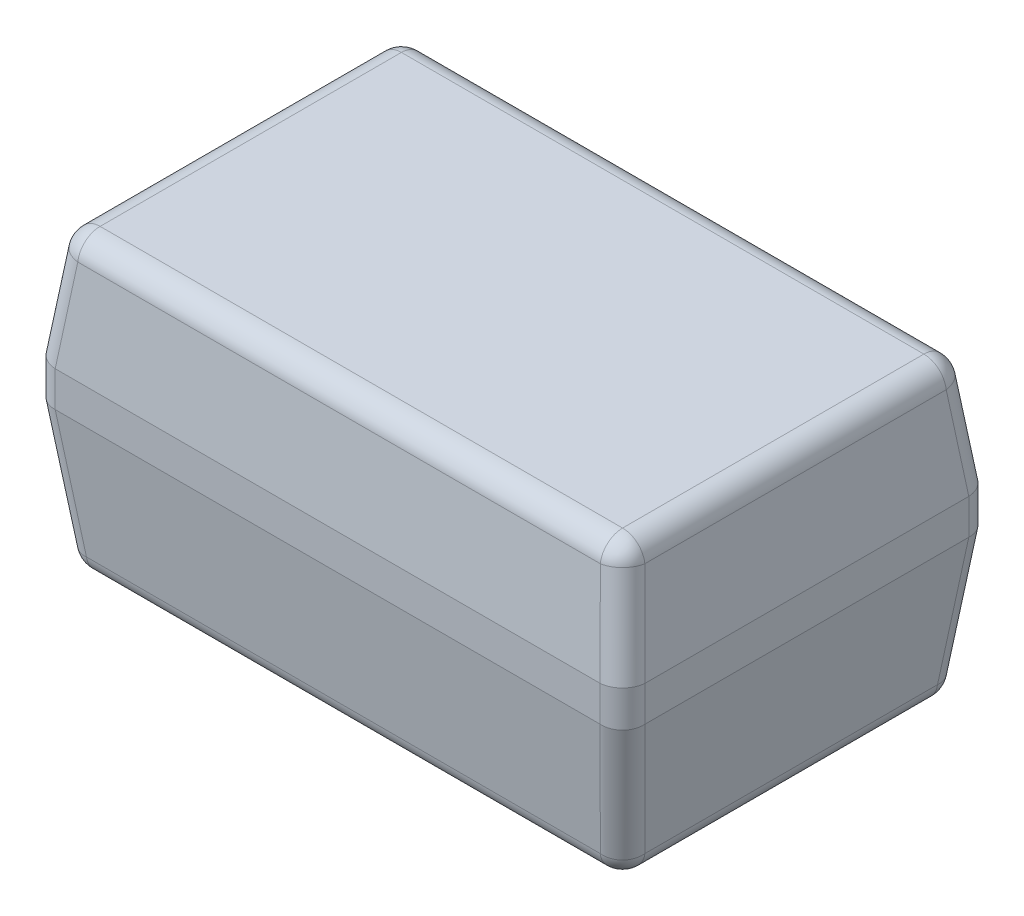
ISO-10303-21;
HEADER;
FILE_DESCRIPTION(('STEP AP214'),'2;1');
FILE_NAME('part.step','',(''),(''),'','','');
FILE_SCHEMA(('AUTOMOTIVE_DESIGN { 1 0 10303 214 1 1 1 1 }'));
ENDSEC;
DATA;
#1=APPLICATION_CONTEXT('core data for automotive mechanical design processes');
#2=APPLICATION_PROTOCOL_DEFINITION('international standard','automotive_design',2000,#1);
#3=PRODUCT_CONTEXT('',#1,'mechanical');
#4=PRODUCT('Part','Part','',(#3));
#5=PRODUCT_RELATED_PRODUCT_CATEGORY('part','',(#4));
#6=PRODUCT_DEFINITION_FORMATION('','',#4);
#7=PRODUCT_DEFINITION_CONTEXT('part definition',#1,'design');
#8=PRODUCT_DEFINITION('design','',#6,#7);
#9=PRODUCT_DEFINITION_SHAPE('','',#8);
#10=(LENGTH_UNIT() NAMED_UNIT(*) SI_UNIT(.MILLI.,.METRE.));
#11=(NAMED_UNIT(*) PLANE_ANGLE_UNIT() SI_UNIT($,.RADIAN.));
#12=(NAMED_UNIT(*) SI_UNIT($,.STERADIAN.) SOLID_ANGLE_UNIT());
#13=UNCERTAINTY_MEASURE_WITH_UNIT(LENGTH_MEASURE(1.E-05),#10,'distance_accuracy_value','');
#14=(GEOMETRIC_REPRESENTATION_CONTEXT(3) GLOBAL_UNCERTAINTY_ASSIGNED_CONTEXT((#13)) GLOBAL_UNIT_ASSIGNED_CONTEXT((#10,
#11,#12)) REPRESENTATION_CONTEXT('',''));
#15=CARTESIAN_POINT('',(0.,0.,0.));
#16=DIRECTION('',(0.,0.,1.));
#17=DIRECTION('',(1.,0.,0.));
#18=AXIS2_PLACEMENT_3D('',#15,#16,#17);
#19=CARTESIAN_POINT('',(-0.871191654389,-0.5438,-0.496191654389));
#20=DIRECTION('',(-0.662620048215886,-0.748955720788871,0.));
#21=DIRECTION('',(0.,0.,-1.));
#22=AXIS2_PLACEMENT_3D('',#19,#20,#21);
#23=SPHERICAL_SURFACE('',#22,0.0762);
#24=CARTESIAN_POINT('',(-0.871191654389,-0.5438,-0.496191654389));
#25=DIRECTION('',(0.,0.,-1.));
#26=DIRECTION('',(-1.,0.,0.));
#27=AXIS2_PLACEMENT_3D('',#24,#25,#26);
#28=CIRCLE('',#27,0.0762);
#29=CARTESIAN_POINT('',(-0.946823671144385,-0.553086443967047,-0.496191654389));
#30=VERTEX_POINT('',#29);
#31=CARTESIAN_POINT('',(-0.92168330206305,-0.600870425924112,-0.496191654389));
#32=VERTEX_POINT('',#31);
#33=EDGE_CURVE('E75',#30,#32,#28,.F.);
#34=ORIENTED_EDGE('',*,*,#33,.F.);
#35=CARTESIAN_POINT('',(-0.871191654389566,-0.5437999999997,-0.496191654389566));
#36=DIRECTION('',(-0.120974291151045,0.985256536015369,-0.120974291151045));
#37=DIRECTION('',(0.,0.121869343404831,0.992546151641361));
#38=AXIS2_PLACEMENT_3D('',#35,#36,#37);
#39=CIRCLE('',#38,0.0762);
#40=CARTESIAN_POINT('',(-0.871191654389408,-0.553086443967097,-0.571823671144379));
#41=VERTEX_POINT('',#40);
#42=EDGE_CURVE('E77',#41,#30,#39,.T.);
#43=ORIENTED_EDGE('',*,*,#42,.F.);
#44=CARTESIAN_POINT('',(-0.871191654389,-0.5438,-0.496191654389));
#45=DIRECTION('',(1.,0.,0.));
#46=DIRECTION('',(0.,0.,-1.));
#47=AXIS2_PLACEMENT_3D('',#44,#45,#46);
#48=CIRCLE('',#47,0.0762);
#49=CARTESIAN_POINT('',(-0.871191654389,-0.62,-0.496191654389));
#50=VERTEX_POINT('',#49);
#51=EDGE_CURVE('E21',#50,#41,#48,.T.);
#52=ORIENTED_EDGE('',*,*,#51,.F.);
#53=CARTESIAN_POINT('',(-0.871191654389,-0.5438,-0.496191654389));
#54=DIRECTION('',(0.,0.,-1.));
#55=DIRECTION('',(-1.,0.,0.));
#56=AXIS2_PLACEMENT_3D('',#53,#54,#55);
#57=CIRCLE('',#56,0.0762);
#58=EDGE_CURVE('E156',#32,#50,#57,.F.);
#59=ORIENTED_EDGE('',*,*,#58,.F.);
#60=EDGE_LOOP('',(#34,#43,#52,#59));
#61=FACE_BOUND('',#60,.T.);
#62=ADVANCED_FACE('F17',(#61),#23,.T.);
#63=CARTESIAN_POINT('',(0.,-0.62,0.));
#64=DIRECTION('',(0.,-1.,0.));
#65=DIRECTION('',(0.,0.,-1.));
#66=AXIS2_PLACEMENT_3D('',#63,#64,#65);
#67=PLANE('',#66);
#68=DIRECTION('',(0.,0.,-1.));
#69=VECTOR('',#68,1.);
#70=CARTESIAN_POINT('',(-0.871191654389,-0.62,0.563607719548));
#71=LINE('',#70,#69);
#72=CARTESIAN_POINT('',(-0.871191654389,-0.62,0.496191654389));
#73=VERTEX_POINT('',#72);
#74=EDGE_CURVE('E186',#50,#73,#71,.F.);
#75=ORIENTED_EDGE('',*,*,#74,.F.);
#76=DIRECTION('',(1.,0.,0.));
#77=VECTOR('',#76,1.);
#78=CARTESIAN_POINT('',(-0.938607719548,-0.62,-0.496191654389));
#79=LINE('',#78,#77);
#80=CARTESIAN_POINT('',(0.871191654389,-0.62,-0.496191654389));
#81=VERTEX_POINT('',#80);
#82=EDGE_CURVE('E183',#81,#50,#79,.F.);
#83=ORIENTED_EDGE('',*,*,#82,.F.);
#84=DIRECTION('',(0.,0.,-1.));
#85=VECTOR('',#84,1.);
#86=CARTESIAN_POINT('',(0.871191654389,-0.62,0.));
#87=LINE('',#86,#85);
#88=CARTESIAN_POINT('',(0.871191654389,-0.62,0.496191654389));
#89=VERTEX_POINT('',#88);
#90=EDGE_CURVE('E182',#81,#89,#87,.F.);
#91=ORIENTED_EDGE('',*,*,#90,.T.);
#92=DIRECTION('',(-1.,0.,0.));
#93=VECTOR('',#92,1.);
#94=CARTESIAN_POINT('',(0.871191654389,-0.62,0.496191654389));
#95=LINE('',#94,#93);
#96=EDGE_CURVE('E148',#73,#89,#95,.F.);
#97=ORIENTED_EDGE('',*,*,#96,.F.);
#98=EDGE_LOOP('',(#75,#83,#91,#97));
#99=FACE_BOUND('',#98,.T.);
#100=ADVANCED_FACE('F178',(#99),#67,.T.);
#101=CARTESIAN_POINT('',(-0.871191654389,-0.5438,0.496191654389));
#102=DIRECTION('',(0.,-0.748955720788871,0.662620048215886));
#103=DIRECTION('',(-1.,0.,0.));
#104=AXIS2_PLACEMENT_3D('',#101,#102,#103);
#105=SPHERICAL_SURFACE('',#104,0.0762);
#106=CARTESIAN_POINT('',(-0.871191654389,-0.5438,0.496191654389));
#107=DIRECTION('',(-1.,0.,0.));
#108=DIRECTION('',(0.,0.,1.));
#109=AXIS2_PLACEMENT_3D('',#106,#107,#108);
#110=CIRCLE('',#109,0.0762);
#111=CARTESIAN_POINT('',(-0.871191654389283,-0.553086443967082,0.571823671144381));
#112=VERTEX_POINT('',#111);
#113=CARTESIAN_POINT('',(-0.871191654389,-0.600870425924112,0.54668330206305));
#114=VERTEX_POINT('',#113);
#115=EDGE_CURVE('E124',#112,#114,#110,.F.);
#116=ORIENTED_EDGE('',*,*,#115,.F.);
#117=CARTESIAN_POINT('',(-0.871191654389566,-0.5437999999997,0.496191654389566));
#118=DIRECTION('',(-0.120974291151045,0.985256536015369,0.120974291151045));
#119=DIRECTION('',(0.,-0.121869343404831,0.992546151641361));
#120=AXIS2_PLACEMENT_3D('',#117,#118,#119);
#121=CIRCLE('',#120,0.0762);
#122=CARTESIAN_POINT('',(-0.946823671144379,-0.553086443967097,0.496191654389408));
#123=VERTEX_POINT('',#122);
#124=EDGE_CURVE('E71',#123,#112,#121,.T.);
#125=ORIENTED_EDGE('',*,*,#124,.F.);
#126=CARTESIAN_POINT('',(-0.871191654389,-0.5438,0.496191654389));
#127=DIRECTION('',(0.,0.,-1.));
#128=DIRECTION('',(-1.,0.,0.));
#129=AXIS2_PLACEMENT_3D('',#126,#127,#128);
#130=CIRCLE('',#129,0.0762);
#131=EDGE_CURVE('E61',#73,#123,#130,.T.);
#132=ORIENTED_EDGE('',*,*,#131,.F.);
#133=CARTESIAN_POINT('',(-0.871191654389,-0.5438,0.496191654389));
#134=DIRECTION('',(-1.,0.,0.));
#135=DIRECTION('',(0.,0.,1.));
#136=AXIS2_PLACEMENT_3D('',#133,#134,#135);
#137=CIRCLE('',#136,0.0762);
#138=EDGE_CURVE('E113',#114,#73,#137,.F.);
#139=ORIENTED_EDGE('',*,*,#138,.F.);
#140=EDGE_LOOP('',(#116,#125,#132,#139));
#141=FACE_BOUND('',#140,.T.);
#142=ADVANCED_FACE('F176',(#141),#105,.T.);
#143=CARTESIAN_POINT('',(0.871191654389,-0.5438,0.496191654389));
#144=DIRECTION('',(0.,-0.748955720788871,0.662620048215886));
#145=DIRECTION('',(1.,0.,0.));
#146=AXIS2_PLACEMENT_3D('',#143,#144,#145);
#147=SPHERICAL_SURFACE('',#146,0.0762);
#148=CARTESIAN_POINT('',(0.871191654389,-0.5438,0.496191654389));
#149=DIRECTION('',(-1.,0.,0.));
#150=DIRECTION('',(0.,0.,1.));
#151=AXIS2_PLACEMENT_3D('',#148,#149,#150);
#152=CIRCLE('',#151,0.0762);
#153=CARTESIAN_POINT('',(0.871191654389,-0.600870425924112,0.54668330206305));
#154=VERTEX_POINT('',#153);
#155=EDGE_CURVE('E123',#89,#154,#152,.T.);
#156=ORIENTED_EDGE('',*,*,#155,.F.);
#157=CARTESIAN_POINT('',(0.871191654389,-0.5438,0.496191654389));
#158=DIRECTION('',(0.,0.,1.));
#159=DIRECTION('',(1.,0.,0.));
#160=AXIS2_PLACEMENT_3D('',#157,#158,#159);
#161=CIRCLE('',#160,0.0762);
#162=CARTESIAN_POINT('',(0.946823671144385,-0.553086443967047,0.496191654389));
#163=VERTEX_POINT('',#162);
#164=EDGE_CURVE('E107',#163,#89,#161,.F.);
#165=ORIENTED_EDGE('',*,*,#164,.F.);
#166=CARTESIAN_POINT('',(0.871191654389566,-0.5437999999997,0.496191654389566));
#167=DIRECTION('',(0.120974291151045,0.985256536015369,0.120974291151045));
#168=DIRECTION('',(0.,-0.121869343404831,0.992546151641361));
#169=AXIS2_PLACEMENT_3D('',#166,#167,#168);
#170=CIRCLE('',#169,0.0762);
#171=CARTESIAN_POINT('',(0.871191654389283,-0.553086443967082,0.571823671144381));
#172=VERTEX_POINT('',#171);
#173=EDGE_CURVE('E100',#172,#163,#170,.T.);
#174=ORIENTED_EDGE('',*,*,#173,.F.);
#175=CARTESIAN_POINT('',(0.871191654389,-0.5438,0.496191654389));
#176=DIRECTION('',(-1.,0.,0.));
#177=DIRECTION('',(0.,0.,1.));
#178=AXIS2_PLACEMENT_3D('',#175,#176,#177);
#179=CIRCLE('',#178,0.0762);
#180=EDGE_CURVE('E104',#154,#172,#179,.T.);
#181=ORIENTED_EDGE('',*,*,#180,.F.);
#182=EDGE_LOOP('',(#156,#165,#174,#181));
#183=FACE_BOUND('',#182,.T.);
#184=ADVANCED_FACE('F103',(#183),#147,.T.);
#185=CARTESIAN_POINT('',(0.871191654389,-0.5438,-0.496191654389));
#186=DIRECTION('',(0.,-0.748955720788871,-0.662620048215886));
#187=DIRECTION('',(1.,0.,0.));
#188=AXIS2_PLACEMENT_3D('',#185,#186,#187);
#189=SPHERICAL_SURFACE('',#188,0.0762);
#190=CARTESIAN_POINT('',(0.871191654389,-0.5438,-0.496191654389));
#191=DIRECTION('',(1.,0.,0.));
#192=DIRECTION('',(0.,0.,-1.));
#193=AXIS2_PLACEMENT_3D('',#190,#191,#192);
#194=CIRCLE('',#193,0.0762);
#195=CARTESIAN_POINT('',(0.871191654389,-0.553086443967047,-0.571823671144385));
#196=VERTEX_POINT('',#195);
#197=CARTESIAN_POINT('',(0.871191654389,-0.600870425924112,-0.54668330206305));
#198=VERTEX_POINT('',#197);
#199=EDGE_CURVE('E80',#196,#198,#194,.F.);
#200=ORIENTED_EDGE('',*,*,#199,.F.);
#201=CARTESIAN_POINT('',(0.871191654389566,-0.5437999999997,-0.496191654389566));
#202=DIRECTION('',(0.120974291151045,0.985256536015369,-0.120974291151045));
#203=DIRECTION('',(0.,0.121869343404831,0.992546151641361));
#204=AXIS2_PLACEMENT_3D('',#201,#202,#203);
#205=CIRCLE('',#204,0.0762);
#206=CARTESIAN_POINT('',(0.946823671144385,-0.553086443967047,-0.496191654389));
#207=VERTEX_POINT('',#206);
#208=EDGE_CURVE('E263',#207,#196,#205,.T.);
#209=ORIENTED_EDGE('',*,*,#208,.F.);
#210=CARTESIAN_POINT('',(0.871191654389,-0.5438,-0.496191654389));
#211=DIRECTION('',(0.,0.,1.));
#212=DIRECTION('',(1.,0.,0.));
#213=AXIS2_PLACEMENT_3D('',#210,#211,#212);
#214=CIRCLE('',#213,0.0762);
#215=EDGE_CURVE('E112',#81,#207,#214,.T.);
#216=ORIENTED_EDGE('',*,*,#215,.F.);
#217=CARTESIAN_POINT('',(0.871191654389,-0.5438,-0.496191654389));
#218=DIRECTION('',(1.,0.,0.));
#219=DIRECTION('',(0.,0.,-1.));
#220=AXIS2_PLACEMENT_3D('',#217,#218,#219);
#221=CIRCLE('',#220,0.0762);
#222=EDGE_CURVE('E36',#198,#81,#221,.F.);
#223=ORIENTED_EDGE('',*,*,#222,.F.);
#224=EDGE_LOOP('',(#200,#209,#216,#223));
#225=FACE_BOUND('',#224,.T.);
#226=ADVANCED_FACE('F168',(#225),#189,.T.);
#227=CARTESIAN_POINT('',(-0.938607719548,-0.5438,-0.496191654389));
#228=DIRECTION('',(1.,0.,0.));
#229=DIRECTION('',(0.,0.,-1.));
#230=AXIS2_PLACEMENT_3D('',#227,#228,#229);
#231=CYLINDRICAL_SURFACE('',#230,0.0762);
#232=DIRECTION('',(1.,0.,0.));
#233=VECTOR('',#232,1.);
#234=CARTESIAN_POINT('',(-1.,-0.553086443967068,-0.57182367114455));
#235=LINE('',#234,#233);
#236=EDGE_CURVE('E157',#196,#41,#235,.F.);
#237=ORIENTED_EDGE('',*,*,#236,.F.);
#238=ORIENTED_EDGE('',*,*,#199,.T.);
#239=ORIENTED_EDGE('',*,*,#222,.T.);
#240=ORIENTED_EDGE('',*,*,#82,.T.);
#241=ORIENTED_EDGE('',*,*,#51,.T.);
#242=EDGE_LOOP('',(#237,#238,#239,#240,#241));
#243=FACE_BOUND('',#242,.T.);
#244=ADVANCED_FACE('F172',(#243),#231,.T.);
#245=CARTESIAN_POINT('',(-0.924367983245,-0.110713556032,-0.549367983245));
#246=DIRECTION('',(-0.120974291151045,0.985256536015369,-0.120974291151045));
#247=DIRECTION('',(0.,0.121869343404831,0.992546151641361));
#248=AXIS2_PLACEMENT_3D('',#245,#246,#247);
#249=CYLINDRICAL_SURFACE('',#248,0.0762);
#250=DIRECTION('',(0.120974291151226,-0.985256536015119,0.1209742911529));
#251=VECTOR('',#250,1.);
#252=CARTESIAN_POINT('',(-0.999997898773815,-0.120017113113977,-0.549365882019));
#253=LINE('',#252,#251);
#254=CARTESIAN_POINT('',(-0.999998949386904,-0.120008556556993,-0.5490829410095));
#255=VERTEX_POINT('',#254);
#256=EDGE_CURVE('E154',#255,#30,#253,.T.);
#257=ORIENTED_EDGE('',*,*,#256,.F.);
#258=CARTESIAN_POINT('',(-0.9238,-0.115339408344577,-0.5488));
#259=DIRECTION('',(0.060711333341953,-0.996307316046452,0.060711333341953));
#260=DIRECTION('',(-0.704495659322215,-0.0858587910019435,-0.704495659322215));
#261=AXIS2_PLACEMENT_3D('',#258,#259,#260);
#262=ELLIPSE('',#261,0.0764824254250957,0.0762);
#263=CARTESIAN_POINT('',(-0.9240829410095,-0.120008556556992,-0.624998949386904));
#264=VERTEX_POINT('',#263);
#265=EDGE_CURVE('E258',#264,#255,#262,.F.);
#266=ORIENTED_EDGE('',*,*,#265,.F.);
#267=DIRECTION('',(-0.1209742911529,0.985256536015119,-0.120974291151226));
#268=VECTOR('',#267,1.);
#269=CARTESIAN_POINT('',(-0.871191654389,-0.553086443967068,-0.57182367114455));
#270=LINE('',#269,#268);
#271=EDGE_CURVE('E160',#41,#264,#270,.T.);
#272=ORIENTED_EDGE('',*,*,#271,.F.);
#273=ORIENTED_EDGE('',*,*,#42,.T.);
#274=EDGE_LOOP('',(#257,#266,#272,#273));
#275=FACE_BOUND('',#274,.T.);
#276=ADVANCED_FACE('F473',(#275),#249,.T.);
#277=CARTESIAN_POINT('',(-0.871191654389,-0.5438,0.563607719548));
#278=DIRECTION('',(0.,0.,-1.));
#279=DIRECTION('',(-1.,0.,0.));
#280=AXIS2_PLACEMENT_3D('',#277,#278,#279);
#281=CYLINDRICAL_SURFACE('',#280,0.0762);
#282=DIRECTION('',(0.,0.,1.));
#283=VECTOR('',#282,1.);
#284=CARTESIAN_POINT('',(-0.94682367114455,-0.553086443967068,0.625));
#285=LINE('',#284,#283);
#286=EDGE_CURVE('E150',#30,#123,#285,.T.);
#287=ORIENTED_EDGE('',*,*,#286,.F.);
#288=ORIENTED_EDGE('',*,*,#33,.T.);
#289=ORIENTED_EDGE('',*,*,#58,.T.);
#290=ORIENTED_EDGE('',*,*,#74,.T.);
#291=ORIENTED_EDGE('',*,*,#131,.T.);
#292=EDGE_LOOP('',(#287,#288,#289,#290,#291));
#293=FACE_BOUND('',#292,.T.);
#294=ADVANCED_FACE('F470',(#293),#281,.T.);
#295=CARTESIAN_POINT('',(-0.924367983245,-0.110713556032,0.549367983245));
#296=DIRECTION('',(-0.120974291151045,0.985256536015369,0.120974291151045));
#297=DIRECTION('',(0.,-0.121869343404831,0.992546151641361));
#298=AXIS2_PLACEMENT_3D('',#295,#296,#297);
#299=CYLINDRICAL_SURFACE('',#298,0.0762);
#300=DIRECTION('',(0.1209742911529,-0.985256536015119,-0.120974291151226));
#301=VECTOR('',#300,1.);
#302=CARTESIAN_POINT('',(-0.924365882019,-0.120017113113977,0.624997898773815));
#303=LINE('',#302,#301);
#304=CARTESIAN_POINT('',(-0.924082941009437,-0.120008556556984,0.624998949386906));
#305=VERTEX_POINT('',#304);
#306=EDGE_CURVE('E139',#305,#112,#303,.T.);
#307=ORIENTED_EDGE('',*,*,#306,.F.);
#308=CARTESIAN_POINT('',(-0.9238,-0.115339408344577,0.5488));
#309=DIRECTION('',(0.060711333341953,-0.996307316046452,-0.060711333341953));
#310=DIRECTION('',(-0.704495659322215,-0.0858587910019435,0.704495659322215));
#311=AXIS2_PLACEMENT_3D('',#308,#309,#310);
#312=ELLIPSE('',#311,0.0764824254250957,0.0762);
#313=CARTESIAN_POINT('',(-0.999998949386904,-0.120008556556993,0.5490829410095));
#314=VERTEX_POINT('',#313);
#315=EDGE_CURVE('E141',#314,#305,#312,.F.);
#316=ORIENTED_EDGE('',*,*,#315,.F.);
#317=DIRECTION('',(-0.120974291151226,0.985256536015119,0.1209742911529));
#318=VECTOR('',#317,1.);
#319=CARTESIAN_POINT('',(-0.94682367114455,-0.553086443967068,0.496191654389));
#320=LINE('',#319,#318);
#321=EDGE_CURVE('E153',#123,#314,#320,.T.);
#322=ORIENTED_EDGE('',*,*,#321,.F.);
#323=ORIENTED_EDGE('',*,*,#124,.T.);
#324=EDGE_LOOP('',(#307,#316,#322,#323));
#325=FACE_BOUND('',#324,.T.);
#326=ADVANCED_FACE('F467',(#325),#299,.T.);
#327=CARTESIAN_POINT('',(0.871191654389,-0.5438,0.496191654389));
#328=DIRECTION('',(-1.,0.,0.));
#329=DIRECTION('',(0.,0.,1.));
#330=AXIS2_PLACEMENT_3D('',#327,#328,#329);
#331=CYLINDRICAL_SURFACE('',#330,0.0762);
#332=DIRECTION('',(1.,0.,0.));
#333=VECTOR('',#332,1.);
#334=CARTESIAN_POINT('',(1.,-0.553086443967068,0.57182367114455));
#335=LINE('',#334,#333);
#336=EDGE_CURVE('E120',#112,#172,#335,.T.);
#337=ORIENTED_EDGE('',*,*,#336,.F.);
#338=ORIENTED_EDGE('',*,*,#115,.T.);
#339=ORIENTED_EDGE('',*,*,#138,.T.);
#340=ORIENTED_EDGE('',*,*,#96,.T.);
#341=ORIENTED_EDGE('',*,*,#155,.T.);
#342=ORIENTED_EDGE('',*,*,#180,.T.);
#343=EDGE_LOOP('',(#337,#338,#339,#340,#341,#342));
#344=FACE_BOUND('',#343,.T.);
#345=ADVANCED_FACE('F117',(#344),#331,.T.);
#346=CARTESIAN_POINT('',(0.924367983245,-0.110713556032,0.549367983245));
#347=DIRECTION('',(0.120974291151045,0.985256536015369,0.120974291151045));
#348=DIRECTION('',(0.,-0.121869343404831,0.992546151641361));
#349=AXIS2_PLACEMENT_3D('',#346,#347,#348);
#350=CYLINDRICAL_SURFACE('',#349,0.0762);
#351=DIRECTION('',(-0.120974291151226,-0.985256536015119,-0.1209742911529));
#352=VECTOR('',#351,1.);
#353=CARTESIAN_POINT('',(0.999997898773815,-0.120017113113977,0.549365882019));
#354=LINE('',#353,#352);
#355=CARTESIAN_POINT('',(0.999998949386904,-0.120008556556993,0.5490829410095));
#356=VERTEX_POINT('',#355);
#357=EDGE_CURVE('E247',#356,#163,#354,.T.);
#358=ORIENTED_EDGE('',*,*,#357,.F.);
#359=CARTESIAN_POINT('',(0.9238,-0.115339408344577,0.5488));
#360=DIRECTION('',(-0.060711333341953,-0.996307316046452,-0.060711333341953));
#361=DIRECTION('',(0.704495659322215,-0.0858587910019435,0.704495659322215));
#362=AXIS2_PLACEMENT_3D('',#359,#360,#361);
#363=ELLIPSE('',#362,0.0764824254250957,0.0762);
#364=CARTESIAN_POINT('',(0.924082941009437,-0.120008556556984,0.624998949386906));
#365=VERTEX_POINT('',#364);
#366=EDGE_CURVE('E132',#365,#356,#363,.F.);
#367=ORIENTED_EDGE('',*,*,#366,.F.);
#368=DIRECTION('',(0.1209742911529,0.985256536015119,0.120974291151226));
#369=VECTOR('',#368,1.);
#370=CARTESIAN_POINT('',(0.871191654389,-0.553086443967068,0.57182367114455));
#371=LINE('',#370,#369);
#372=EDGE_CURVE('E128',#172,#365,#371,.T.);
#373=ORIENTED_EDGE('',*,*,#372,.F.);
#374=ORIENTED_EDGE('',*,*,#173,.T.);
#375=EDGE_LOOP('',(#358,#367,#373,#374));
#376=FACE_BOUND('',#375,.T.);
#377=ADVANCED_FACE('F129',(#376),#350,.T.);
#378=CARTESIAN_POINT('',(0.871191654389,-0.5438,-0.563607719548));
#379=DIRECTION('',(0.,0.,1.));
#380=DIRECTION('',(1.,0.,0.));
#381=AXIS2_PLACEMENT_3D('',#378,#379,#380);
#382=CYLINDRICAL_SURFACE('',#381,0.0762);
#383=DIRECTION('',(0.,0.,1.));
#384=VECTOR('',#383,1.);
#385=CARTESIAN_POINT('',(0.94682367114455,-0.553086443967068,-0.625));
#386=LINE('',#385,#384);
#387=EDGE_CURVE('E145',#163,#207,#386,.F.);
#388=ORIENTED_EDGE('',*,*,#387,.F.);
#389=ORIENTED_EDGE('',*,*,#164,.T.);
#390=ORIENTED_EDGE('',*,*,#90,.F.);
#391=ORIENTED_EDGE('',*,*,#215,.T.);
#392=EDGE_LOOP('',(#388,#389,#390,#391));
#393=FACE_BOUND('',#392,.T.);
#394=ADVANCED_FACE('F459',(#393),#382,.T.);
#395=CARTESIAN_POINT('',(0.924367983245,-0.110713556032,-0.549367983245));
#396=DIRECTION('',(0.120974291151045,0.985256536015369,-0.120974291151045));
#397=DIRECTION('',(0.,0.121869343404831,0.992546151641361));
#398=AXIS2_PLACEMENT_3D('',#395,#396,#397);
#399=CYLINDRICAL_SURFACE('',#398,0.0762);
#400=DIRECTION('',(-0.1209742911529,-0.985256536015119,0.120974291151226));
#401=VECTOR('',#400,1.);
#402=CARTESIAN_POINT('',(0.924365882019,-0.120017113113977,-0.624997898773815));
#403=LINE('',#402,#401);
#404=CARTESIAN_POINT('',(0.9240829410095,-0.120008556556992,-0.624998949386904));
#405=VERTEX_POINT('',#404);
#406=EDGE_CURVE('E161',#405,#196,#403,.T.);
#407=ORIENTED_EDGE('',*,*,#406,.F.);
#408=CARTESIAN_POINT('',(0.9238,-0.115339408344577,-0.5488));
#409=DIRECTION('',(-0.060711333341953,-0.996307316046452,0.060711333341953));
#410=DIRECTION('',(0.704495659322215,-0.0858587910019435,-0.704495659322215));
#411=AXIS2_PLACEMENT_3D('',#408,#409,#410);
#412=ELLIPSE('',#411,0.0764824254250957,0.0762);
#413=CARTESIAN_POINT('',(0.999998949386904,-0.120008556556993,-0.5490829410095));
#414=VERTEX_POINT('',#413);
#415=EDGE_CURVE('E239',#414,#405,#412,.F.);
#416=ORIENTED_EDGE('',*,*,#415,.F.);
#417=DIRECTION('',(0.120974291151226,0.985256536015119,-0.1209742911529));
#418=VECTOR('',#417,1.);
#419=CARTESIAN_POINT('',(0.94682367114455,-0.553086443967068,-0.496191654389));
#420=LINE('',#419,#418);
#421=EDGE_CURVE('E243',#207,#414,#420,.T.);
#422=ORIENTED_EDGE('',*,*,#421,.F.);
#423=ORIENTED_EDGE('',*,*,#208,.T.);
#424=EDGE_LOOP('',(#407,#416,#422,#423));
#425=FACE_BOUND('',#424,.T.);
#426=ADVANCED_FACE('F456',(#425),#399,.T.);
#427=CARTESIAN_POINT('',(-1.,-0.12,-0.625));
#428=DIRECTION('',(0.,-0.121869343405041,-0.992546151641335));
#429=DIRECTION('',(0.,0.992546151641335,-0.121869343405041));
#430=AXIS2_PLACEMENT_3D('',#427,#428,#429);
#431=PLANE('',#430);
#432=ORIENTED_EDGE('',*,*,#236,.T.);
#433=ORIENTED_EDGE('',*,*,#271,.T.);
#434=DIRECTION('',(-1.,0.,0.));
#435=VECTOR('',#434,1.);
#436=CARTESIAN_POINT('',(1.,-0.12,-0.625));
#437=LINE('',#436,#435);
#438=EDGE_CURVE('E283',#405,#264,#437,.T.);
#439=ORIENTED_EDGE('',*,*,#438,.F.);
#440=ORIENTED_EDGE('',*,*,#406,.T.);
#441=EDGE_LOOP('',(#432,#433,#439,#440));
#442=FACE_BOUND('',#441,.T.);
#443=ADVANCED_FACE('F281',(#442),#431,.T.);
#444=CARTESIAN_POINT('',(-0.9238,0.,-0.5488));
#445=DIRECTION('',(0.,-1.,0.));
#446=DIRECTION('',(0.,0.,-1.));
#447=AXIS2_PLACEMENT_3D('',#444,#445,#446);
#448=CYLINDRICAL_SURFACE('',#447,0.0762);
#449=DIRECTION('',(0.,1.,0.));
#450=VECTOR('',#449,1.);
#451=CARTESIAN_POINT('',(-0.9238,0.,-0.625));
#452=LINE('',#451,#450);
#453=CARTESIAN_POINT('',(-0.924082941009465,8.55655707444713E-06,-0.624998949386908));
#454=VERTEX_POINT('',#453);
#455=EDGE_CURVE('E236',#264,#454,#452,.T.);
#456=ORIENTED_EDGE('',*,*,#455,.F.);
#457=ORIENTED_EDGE('',*,*,#265,.T.);
#458=DIRECTION('',(0.,1.,0.));
#459=VECTOR('',#458,1.);
#460=CARTESIAN_POINT('',(-1.,0.,-0.5488));
#461=LINE('',#460,#459);
#462=CARTESIAN_POINT('',(-0.999998949386907,8.55655707863815E-06,-0.5490829410095));
#463=VERTEX_POINT('',#462);
#464=EDGE_CURVE('E235',#463,#255,#461,.F.);
#465=ORIENTED_EDGE('',*,*,#464,.F.);
#466=CARTESIAN_POINT('',(-0.9238,-0.00466059165489473,-0.5488));
#467=DIRECTION('',(-0.060711333341953,-0.996307316046452,-0.060711333341953));
#468=DIRECTION('',(-0.704495659322215,0.0858587910019435,-0.704495659322215));
#469=AXIS2_PLACEMENT_3D('',#466,#467,#468);
#470=ELLIPSE('',#469,0.0764824254250957,0.0762);
#471=EDGE_CURVE('E232',#454,#463,#470,.F.);
#472=ORIENTED_EDGE('',*,*,#471,.F.);
#473=EDGE_LOOP('',(#456,#457,#465,#472));
#474=FACE_BOUND('',#473,.T.);
#475=ADVANCED_FACE('F449',(#474),#448,.T.);
#476=CARTESIAN_POINT('',(-1.,-0.12,0.625));
#477=DIRECTION('',(-0.992546151641335,-0.121869343405041,0.));
#478=DIRECTION('',(0.121869343405041,-0.992546151641335,0.));
#479=AXIS2_PLACEMENT_3D('',#476,#477,#478);
#480=PLANE('',#479);
#481=ORIENTED_EDGE('',*,*,#286,.T.);
#482=ORIENTED_EDGE('',*,*,#321,.T.);
#483=DIRECTION('',(0.,0.,1.));
#484=VECTOR('',#483,1.);
#485=CARTESIAN_POINT('',(-1.,-0.12,-0.625));
#486=LINE('',#485,#484);
#487=EDGE_CURVE('E306',#255,#314,#486,.T.);
#488=ORIENTED_EDGE('',*,*,#487,.F.);
#489=ORIENTED_EDGE('',*,*,#256,.T.);
#490=EDGE_LOOP('',(#481,#482,#488,#489));
#491=FACE_BOUND('',#490,.T.);
#492=ADVANCED_FACE('F445',(#491),#480,.T.);
#493=CARTESIAN_POINT('',(-0.9238,0.,0.5488));
#494=DIRECTION('',(0.,-1.,0.));
#495=DIRECTION('',(0.,0.,-1.));
#496=AXIS2_PLACEMENT_3D('',#493,#494,#495);
#497=CYLINDRICAL_SURFACE('',#496,0.0762);
#498=DIRECTION('',(0.,1.,0.));
#499=VECTOR('',#498,1.);
#500=CARTESIAN_POINT('',(-1.,0.,0.5488));
#501=LINE('',#500,#499);
#502=CARTESIAN_POINT('',(-0.999998949386908,8.55655707862672E-06,0.5490829410095));
#503=VERTEX_POINT('',#502);
#504=EDGE_CURVE('E229',#314,#503,#501,.T.);
#505=ORIENTED_EDGE('',*,*,#504,.F.);
#506=ORIENTED_EDGE('',*,*,#315,.T.);
#507=DIRECTION('',(0.,1.,0.));
#508=VECTOR('',#507,1.);
#509=CARTESIAN_POINT('',(-0.9238,0.,0.625));
#510=LINE('',#509,#508);
#511=CARTESIAN_POINT('',(-0.9240829410095,8.55655707862536E-06,0.624998949386907));
#512=VERTEX_POINT('',#511);
#513=EDGE_CURVE('E228',#512,#305,#510,.F.);
#514=ORIENTED_EDGE('',*,*,#513,.F.);
#515=CARTESIAN_POINT('',(-0.9238,-0.00466059165489473,0.5488));
#516=DIRECTION('',(-0.060711333341953,-0.996307316046452,0.060711333341953));
#517=DIRECTION('',(-0.704495659322215,0.0858587910019435,0.704495659322215));
#518=AXIS2_PLACEMENT_3D('',#515,#516,#517);
#519=ELLIPSE('',#518,0.0764824254250957,0.0762);
#520=EDGE_CURVE('E225',#503,#512,#519,.F.);
#521=ORIENTED_EDGE('',*,*,#520,.F.);
#522=EDGE_LOOP('',(#505,#506,#514,#521));
#523=FACE_BOUND('',#522,.T.);
#524=ADVANCED_FACE('F442',(#523),#497,.T.);
#525=CARTESIAN_POINT('',(1.,-0.12,0.625));
#526=DIRECTION('',(0.,-0.121869343405041,0.992546151641335));
#527=DIRECTION('',(0.,-0.992546151641335,-0.121869343405041));
#528=AXIS2_PLACEMENT_3D('',#525,#526,#527);
#529=PLANE('',#528);
#530=ORIENTED_EDGE('',*,*,#336,.T.);
#531=ORIENTED_EDGE('',*,*,#372,.T.);
#532=DIRECTION('',(1.,0.,0.));
#533=VECTOR('',#532,1.);
#534=CARTESIAN_POINT('',(-1.,-0.12,0.625));
#535=LINE('',#534,#533);
#536=EDGE_CURVE('E311',#305,#365,#535,.T.);
#537=ORIENTED_EDGE('',*,*,#536,.F.);
#538=ORIENTED_EDGE('',*,*,#306,.T.);
#539=EDGE_LOOP('',(#530,#531,#537,#538));
#540=FACE_BOUND('',#539,.T.);
#541=ADVANCED_FACE('F137',(#540),#529,.T.);
#542=CARTESIAN_POINT('',(0.9238,0.,0.5488));
#543=DIRECTION('',(0.,-1.,0.));
#544=DIRECTION('',(0.,0.,-1.));
#545=AXIS2_PLACEMENT_3D('',#542,#543,#544);
#546=CYLINDRICAL_SURFACE('',#545,0.0762);
#547=DIRECTION('',(0.,1.,0.));
#548=VECTOR('',#547,1.);
#549=CARTESIAN_POINT('',(0.9238,0.,0.625));
#550=LINE('',#549,#548);
#551=CARTESIAN_POINT('',(0.9240829410095,8.55655707861207E-06,0.624998949386907));
#552=VERTEX_POINT('',#551);
#553=EDGE_CURVE('E222',#365,#552,#550,.T.);
#554=ORIENTED_EDGE('',*,*,#553,.F.);
#555=ORIENTED_EDGE('',*,*,#366,.T.);
#556=DIRECTION('',(0.,1.,0.));
#557=VECTOR('',#556,1.);
#558=CARTESIAN_POINT('',(1.,0.,0.5488));
#559=LINE('',#558,#557);
#560=CARTESIAN_POINT('',(0.999998949386907,8.55655707864437E-06,0.5490829410095));
#561=VERTEX_POINT('',#560);
#562=EDGE_CURVE('E221',#561,#356,#559,.F.);
#563=ORIENTED_EDGE('',*,*,#562,.F.);
#564=CARTESIAN_POINT('',(0.9238,-0.00466059165489473,0.5488));
#565=DIRECTION('',(0.060711333341953,-0.996307316046452,0.060711333341953));
#566=DIRECTION('',(0.704495659322215,0.0858587910019435,0.704495659322215));
#567=AXIS2_PLACEMENT_3D('',#564,#565,#566);
#568=ELLIPSE('',#567,0.0764824254250957,0.0762);
#569=EDGE_CURVE('E218',#552,#561,#568,.F.);
#570=ORIENTED_EDGE('',*,*,#569,.F.);
#571=EDGE_LOOP('',(#554,#555,#563,#570));
#572=FACE_BOUND('',#571,.T.);
#573=ADVANCED_FACE('F435',(#572),#546,.T.);
#574=CARTESIAN_POINT('',(1.,-0.12,-0.625));
#575=DIRECTION('',(0.992546151641335,-0.121869343405041,0.));
#576=DIRECTION('',(0.121869343405041,0.992546151641335,0.));
#577=AXIS2_PLACEMENT_3D('',#574,#575,#576);
#578=PLANE('',#577);
#579=ORIENTED_EDGE('',*,*,#387,.T.);
#580=ORIENTED_EDGE('',*,*,#421,.T.);
#581=DIRECTION('',(0.,0.,-1.));
#582=VECTOR('',#581,1.);
#583=CARTESIAN_POINT('',(1.,-0.12,0.625));
#584=LINE('',#583,#582);
#585=EDGE_CURVE('E324',#356,#414,#584,.T.);
#586=ORIENTED_EDGE('',*,*,#585,.F.);
#587=ORIENTED_EDGE('',*,*,#357,.T.);
#588=EDGE_LOOP('',(#579,#580,#586,#587));
#589=FACE_BOUND('',#588,.T.);
#590=ADVANCED_FACE('F431',(#589),#578,.T.);
#591=CARTESIAN_POINT('',(0.9238,0.,-0.5488));
#592=DIRECTION('',(0.,-1.,0.));
#593=DIRECTION('',(0.,0.,-1.));
#594=AXIS2_PLACEMENT_3D('',#591,#592,#593);
#595=CYLINDRICAL_SURFACE('',#594,0.0762);
#596=DIRECTION('',(0.,1.,0.));
#597=VECTOR('',#596,1.);
#598=CARTESIAN_POINT('',(1.,0.,-0.5488));
#599=LINE('',#598,#597);
#600=CARTESIAN_POINT('',(0.999998949386907,8.55655707862575E-06,-0.5490829410095));
#601=VERTEX_POINT('',#600);
#602=EDGE_CURVE('E215',#414,#601,#599,.T.);
#603=ORIENTED_EDGE('',*,*,#602,.F.);
#604=ORIENTED_EDGE('',*,*,#415,.T.);
#605=DIRECTION('',(0.,1.,0.));
#606=VECTOR('',#605,1.);
#607=CARTESIAN_POINT('',(0.9238,0.,-0.625));
#608=LINE('',#607,#606);
#609=CARTESIAN_POINT('',(0.924082941009465,8.55655707447767E-06,-0.624998949386908));
#610=VERTEX_POINT('',#609);
#611=EDGE_CURVE('E242',#610,#405,#608,.F.);
#612=ORIENTED_EDGE('',*,*,#611,.F.);
#613=CARTESIAN_POINT('',(0.9238,-0.00466059165489473,-0.5488));
#614=DIRECTION('',(0.060711333341953,-0.996307316046452,-0.060711333341953));
#615=DIRECTION('',(0.704495659322215,0.0858587910019435,-0.704495659322215));
#616=AXIS2_PLACEMENT_3D('',#613,#614,#615);
#617=ELLIPSE('',#616,0.0764824254250957,0.0762);
#618=EDGE_CURVE('E211',#601,#610,#617,.F.);
#619=ORIENTED_EDGE('',*,*,#618,.F.);
#620=EDGE_LOOP('',(#603,#604,#612,#619));
#621=FACE_BOUND('',#620,.T.);
#622=ADVANCED_FACE('F427',(#621),#595,.T.);
#623=CARTESIAN_POINT('',(1.,0.,-0.625));
#624=DIRECTION('',(0.,0.,-1.));
#625=DIRECTION('',(-1.,0.,0.));
#626=AXIS2_PLACEMENT_3D('',#623,#624,#625);
#627=PLANE('',#626);
#628=ORIENTED_EDGE('',*,*,#438,.T.);
#629=ORIENTED_EDGE('',*,*,#455,.T.);
#630=DIRECTION('',(1.,0.,0.));
#631=VECTOR('',#630,1.);
#632=CARTESIAN_POINT('',(1.,0.,-0.625));
#633=LINE('',#632,#631);
#634=EDGE_CURVE('E362',#610,#454,#633,.F.);
#635=ORIENTED_EDGE('',*,*,#634,.F.);
#636=ORIENTED_EDGE('',*,*,#611,.T.);
#637=EDGE_LOOP('',(#628,#629,#635,#636));
#638=FACE_BOUND('',#637,.T.);
#639=ADVANCED_FACE('F423',(#638),#627,.T.);
#640=CARTESIAN_POINT('',(-0.924367983245,-0.009286443967472,-0.549367983245));
#641=DIRECTION('',(-0.120974291151045,-0.985256536015369,-0.120974291151045));
#642=DIRECTION('',(0.,0.121869343404831,-0.992546151641361));
#643=AXIS2_PLACEMENT_3D('',#640,#641,#642);
#644=CYLINDRICAL_SURFACE('',#643,0.0762);
#645=ORIENTED_EDGE('',*,*,#471,.T.);
#646=DIRECTION('',(-0.120974291151246,-0.98525653601528,-0.120974291151567));
#647=VECTOR('',#646,1.);
#648=CARTESIAN_POINT('',(-0.961557818452896,0.313086443966987,-0.510925801698));
#649=LINE('',#648,#647);
#650=CARTESIAN_POINT('',(-0.961557818452962,0.313086443967005,-0.510925801698083));
#651=VERTEX_POINT('',#650);
#652=EDGE_CURVE('E209',#651,#463,#649,.T.);
#653=ORIENTED_EDGE('',*,*,#652,.F.);
#654=CARTESIAN_POINT('',(-0.885925801697959,0.303799999999551,-0.510925801697959));
#655=DIRECTION('',(-0.120974291151045,-0.985256536015369,-0.120974291151045));
#656=DIRECTION('',(0.,0.121869343404831,-0.992546151641361));
#657=AXIS2_PLACEMENT_3D('',#654,#655,#656);
#658=CIRCLE('',#657,0.0762);
#659=CARTESIAN_POINT('',(-0.885925801698,0.313086443967001,-0.58655781845301));
#660=VERTEX_POINT('',#659);
#661=EDGE_CURVE('E206',#660,#651,#658,.F.);
#662=ORIENTED_EDGE('',*,*,#661,.F.);
#663=DIRECTION('',(0.120974291151567,0.98525653601528,0.120974291151246));
#664=VECTOR('',#663,1.);
#665=CARTESIAN_POINT('',(-0.924365882019,1.71131141460215E-05,-0.624997898773794));
#666=LINE('',#665,#664);
#667=EDGE_CURVE('E210',#454,#660,#666,.T.);
#668=ORIENTED_EDGE('',*,*,#667,.F.);
#669=EDGE_LOOP('',(#645,#653,#662,#668));
#670=FACE_BOUND('',#669,.T.);
#671=ADVANCED_FACE('F419',(#670),#644,.T.);
#672=CARTESIAN_POINT('',(-1.,0.,-0.625));
#673=DIRECTION('',(-1.,0.,0.));
#674=DIRECTION('',(0.,0.,1.));
#675=AXIS2_PLACEMENT_3D('',#672,#673,#674);
#676=PLANE('',#675);
#677=ORIENTED_EDGE('',*,*,#487,.T.);
#678=ORIENTED_EDGE('',*,*,#504,.T.);
#679=DIRECTION('',(0.,0.,1.));
#680=VECTOR('',#679,1.);
#681=CARTESIAN_POINT('',(-1.,0.,-0.625));
#682=LINE('',#681,#680);
#683=EDGE_CURVE('E588',#463,#503,#682,.T.);
#684=ORIENTED_EDGE('',*,*,#683,.F.);
#685=ORIENTED_EDGE('',*,*,#464,.T.);
#686=EDGE_LOOP('',(#677,#678,#684,#685));
#687=FACE_BOUND('',#686,.T.);
#688=ADVANCED_FACE('F415',(#687),#676,.T.);
#689=CARTESIAN_POINT('',(-0.924367983245,-0.009286443967472,0.549367983245));
#690=DIRECTION('',(-0.120974291151045,-0.985256536015369,0.120974291151045));
#691=DIRECTION('',(0.,-0.121869343404831,-0.992546151641361));
#692=AXIS2_PLACEMENT_3D('',#689,#690,#691);
#693=CYLINDRICAL_SURFACE('',#692,0.0762);
#694=ORIENTED_EDGE('',*,*,#520,.T.);
#695=DIRECTION('',(-0.120974291151567,-0.98525653601528,0.120974291151246));
#696=VECTOR('',#695,1.);
#697=CARTESIAN_POINT('',(-0.885925801698,0.313086443966987,0.586557818452896));
#698=LINE('',#697,#696);
#699=CARTESIAN_POINT('',(-0.885925801698083,0.313086443967005,0.586557818452961));
#700=VERTEX_POINT('',#699);
#701=EDGE_CURVE('E204',#700,#512,#698,.T.);
#702=ORIENTED_EDGE('',*,*,#701,.F.);
#703=CARTESIAN_POINT('',(-0.885925801697959,0.303799999999551,0.510925801697959));
#704=DIRECTION('',(-0.120974291151045,-0.985256536015369,0.120974291151045));
#705=DIRECTION('',(0.,-0.121869343404831,-0.992546151641361));
#706=AXIS2_PLACEMENT_3D('',#703,#704,#705);
#707=CIRCLE('',#706,0.0762);
#708=CARTESIAN_POINT('',(-0.96155781845301,0.313086443967002,0.510925801698));
#709=VERTEX_POINT('',#708);
#710=EDGE_CURVE('E201',#709,#700,#707,.F.);
#711=ORIENTED_EDGE('',*,*,#710,.F.);
#712=DIRECTION('',(0.120974291151246,0.98525653601528,-0.120974291151567));
#713=VECTOR('',#712,1.);
#714=CARTESIAN_POINT('',(-0.999997898773794,1.71131141460345E-05,0.549365882019));
#715=LINE('',#714,#713);
#716=EDGE_CURVE('E205',#503,#709,#715,.T.);
#717=ORIENTED_EDGE('',*,*,#716,.F.);
#718=EDGE_LOOP('',(#694,#702,#711,#717));
#719=FACE_BOUND('',#718,.T.);
#720=ADVANCED_FACE('F411',(#719),#693,.T.);
#721=CARTESIAN_POINT('',(-1.,0.,0.625));
#722=DIRECTION('',(0.,0.,1.));
#723=DIRECTION('',(1.,0.,0.));
#724=AXIS2_PLACEMENT_3D('',#721,#722,#723);
#725=PLANE('',#724);
#726=ORIENTED_EDGE('',*,*,#536,.T.);
#727=ORIENTED_EDGE('',*,*,#553,.T.);
#728=DIRECTION('',(1.,0.,0.));
#729=VECTOR('',#728,1.);
#730=CARTESIAN_POINT('',(-1.,0.,0.625));
#731=LINE('',#730,#729);
#732=EDGE_CURVE('E645',#512,#552,#731,.T.);
#733=ORIENTED_EDGE('',*,*,#732,.F.);
#734=ORIENTED_EDGE('',*,*,#513,.T.);
#735=EDGE_LOOP('',(#726,#727,#733,#734));
#736=FACE_BOUND('',#735,.T.);
#737=ADVANCED_FACE('F407',(#736),#725,.T.);
#738=CARTESIAN_POINT('',(0.924367983245,-0.009286443967472,0.549367983245));
#739=DIRECTION('',(0.120974291151045,-0.985256536015369,0.120974291151045));
#740=DIRECTION('',(0.,-0.121869343404831,-0.992546151641361));
#741=AXIS2_PLACEMENT_3D('',#738,#739,#740);
#742=CYLINDRICAL_SURFACE('',#741,0.0762);
#743=ORIENTED_EDGE('',*,*,#569,.T.);
#744=DIRECTION('',(0.120974291151246,-0.98525653601528,0.120974291151567));
#745=VECTOR('',#744,1.);
#746=CARTESIAN_POINT('',(0.961557818452896,0.313086443966987,0.510925801698));
#747=LINE('',#746,#745);
#748=CARTESIAN_POINT('',(0.961557818452962,0.313086443967005,0.510925801698083));
#749=VERTEX_POINT('',#748);
#750=EDGE_CURVE('E199',#749,#561,#747,.T.);
#751=ORIENTED_EDGE('',*,*,#750,.F.);
#752=CARTESIAN_POINT('',(0.885925801697959,0.303799999999551,0.510925801697959));
#753=DIRECTION('',(0.120974291151045,-0.985256536015369,0.120974291151045));
#754=DIRECTION('',(0.,-0.121869343404831,-0.992546151641361));
#755=AXIS2_PLACEMENT_3D('',#752,#753,#754);
#756=CIRCLE('',#755,0.0762);
#757=CARTESIAN_POINT('',(0.885925801698,0.313086443967001,0.58655781845301));
#758=VERTEX_POINT('',#757);
#759=EDGE_CURVE('E196',#758,#749,#756,.F.);
#760=ORIENTED_EDGE('',*,*,#759,.F.);
#761=DIRECTION('',(-0.120974291151567,0.98525653601528,-0.120974291151246));
#762=VECTOR('',#761,1.);
#763=CARTESIAN_POINT('',(0.924365882019,1.71131141460118E-05,0.624997898773794));
#764=LINE('',#763,#762);
#765=EDGE_CURVE('E200',#552,#758,#764,.T.);
#766=ORIENTED_EDGE('',*,*,#765,.F.);
#767=EDGE_LOOP('',(#743,#751,#760,#766));
#768=FACE_BOUND('',#767,.T.);
#769=ADVANCED_FACE('F403',(#768),#742,.T.);
#770=CARTESIAN_POINT('',(1.,0.,0.625));
#771=DIRECTION('',(1.,0.,0.));
#772=DIRECTION('',(0.,0.,-1.));
#773=AXIS2_PLACEMENT_3D('',#770,#771,#772);
#774=PLANE('',#773);
#775=ORIENTED_EDGE('',*,*,#585,.T.);
#776=ORIENTED_EDGE('',*,*,#602,.T.);
#777=DIRECTION('',(0.,0.,1.));
#778=VECTOR('',#777,1.);
#779=CARTESIAN_POINT('',(1.,0.,0.625));
#780=LINE('',#779,#778);
#781=EDGE_CURVE('E538',#561,#601,#780,.F.);
#782=ORIENTED_EDGE('',*,*,#781,.F.);
#783=ORIENTED_EDGE('',*,*,#562,.T.);
#784=EDGE_LOOP('',(#775,#776,#782,#783));
#785=FACE_BOUND('',#784,.T.);
#786=ADVANCED_FACE('F399',(#785),#774,.T.);
#787=CARTESIAN_POINT('',(0.924367983245,-0.009286443967472,-0.549367983245));
#788=DIRECTION('',(0.120974291151045,-0.985256536015369,-0.120974291151045));
#789=DIRECTION('',(0.,0.121869343404831,-0.992546151641361));
#790=AXIS2_PLACEMENT_3D('',#787,#788,#789);
#791=CYLINDRICAL_SURFACE('',#790,0.0762);
#792=ORIENTED_EDGE('',*,*,#618,.T.);
#793=DIRECTION('',(0.120974291151567,-0.98525653601528,-0.120974291151246));
#794=VECTOR('',#793,1.);
#795=CARTESIAN_POINT('',(0.885925801698,0.313086443966987,-0.586557818452896));
#796=LINE('',#795,#794);
#797=CARTESIAN_POINT('',(0.885925801698,0.313086443967001,-0.58655781845301));
#798=VERTEX_POINT('',#797);
#799=EDGE_CURVE('E214',#798,#610,#796,.T.);
#800=ORIENTED_EDGE('',*,*,#799,.F.);
#801=CARTESIAN_POINT('',(0.885925801697959,0.303799999999551,-0.510925801697959));
#802=DIRECTION('',(0.120974291151045,-0.985256536015369,-0.120974291151045));
#803=DIRECTION('',(0.,0.121869343404831,-0.992546151641361));
#804=AXIS2_PLACEMENT_3D('',#801,#802,#803);
#805=CIRCLE('',#804,0.0762);
#806=CARTESIAN_POINT('',(0.96155781845301,0.313086443967002,-0.510925801698));
#807=VERTEX_POINT('',#806);
#808=EDGE_CURVE('E191',#807,#798,#805,.F.);
#809=ORIENTED_EDGE('',*,*,#808,.F.);
#810=DIRECTION('',(-0.120974291151246,0.98525653601528,0.120974291151567));
#811=VECTOR('',#810,1.);
#812=CARTESIAN_POINT('',(0.999997898773794,1.71131141460345E-05,-0.549365882019));
#813=LINE('',#812,#811);
#814=EDGE_CURVE('E195',#601,#807,#813,.T.);
#815=ORIENTED_EDGE('',*,*,#814,.F.);
#816=EDGE_LOOP('',(#792,#800,#809,#815));
#817=FACE_BOUND('',#816,.T.);
#818=ADVANCED_FACE('F395',(#817),#791,.T.);
#819=CARTESIAN_POINT('',(1.,0.,-0.625));
#820=DIRECTION('',(0.,0.121869343405041,-0.992546151641335));
#821=DIRECTION('',(0.,0.992546151641335,0.121869343405041));
#822=AXIS2_PLACEMENT_3D('',#819,#820,#821);
#823=PLANE('',#822);
#824=ORIENTED_EDGE('',*,*,#634,.T.);
#825=ORIENTED_EDGE('',*,*,#667,.T.);
#826=DIRECTION('',(-1.,0.,0.));
#827=VECTOR('',#826,1.);
#828=CARTESIAN_POINT('',(0.5,0.313086443967015,-0.586557818453125));
#829=LINE('',#828,#827);
#830=EDGE_CURVE('E371',#798,#660,#829,.T.);
#831=ORIENTED_EDGE('',*,*,#830,.F.);
#832=ORIENTED_EDGE('',*,*,#799,.T.);
#833=EDGE_LOOP('',(#824,#825,#831,#832));
#834=FACE_BOUND('',#833,.T.);
#835=ADVANCED_FACE('F390',(#834),#823,.T.);
#836=CARTESIAN_POINT('',(-0.885925801698,0.3038,-0.510925801698));
#837=DIRECTION('',(1.,0.,0.));
#838=DIRECTION('',(0.,1.,0.));
#839=AXIS2_PLACEMENT_3D('',#836,#837,#838);
#840=SPHERICAL_SURFACE('',#839,0.0762);
#841=CARTESIAN_POINT('',(-0.885925801698,0.3038,-0.510925801698));
#842=DIRECTION('',(-1.,0.,0.));
#843=DIRECTION('',(0.,0.,1.));
#844=AXIS2_PLACEMENT_3D('',#841,#842,#843);
#845=CIRCLE('',#844,0.0762);
#846=CARTESIAN_POINT('',(-0.885925801698,0.38,-0.510925801698));
#847=VERTEX_POINT('',#846);
#848=EDGE_CURVE('E374',#660,#847,#845,.F.);
#849=ORIENTED_EDGE('',*,*,#848,.F.);
#850=ORIENTED_EDGE('',*,*,#661,.T.);
#851=CARTESIAN_POINT('',(-0.885925801698,0.3038,-0.510925801698));
#852=DIRECTION('',(0.,0.,1.));
#853=DIRECTION('',(1.,0.,0.));
#854=AXIS2_PLACEMENT_3D('',#851,#852,#853);
#855=CIRCLE('',#854,0.0762);
#856=EDGE_CURVE('E379',#847,#651,#855,.T.);
#857=ORIENTED_EDGE('',*,*,#856,.F.);
#858=EDGE_LOOP('',(#849,#850,#857));
#859=FACE_BOUND('',#858,.T.);
#860=ADVANCED_FACE('F385',(#859),#840,.T.);
#861=CARTESIAN_POINT('',(-1.,0.,-0.625));
#862=DIRECTION('',(-0.992546151641335,0.121869343405041,0.));
#863=DIRECTION('',(-0.121869343405041,-0.992546151641335,0.));
#864=AXIS2_PLACEMENT_3D('',#861,#862,#863);
#865=PLANE('',#864);
#866=ORIENTED_EDGE('',*,*,#683,.T.);
#867=ORIENTED_EDGE('',*,*,#716,.T.);
#868=DIRECTION('',(0.,0.,1.));
#869=VECTOR('',#868,1.);
#870=CARTESIAN_POINT('',(-0.961557818453125,0.313086443967015,-0.3125));
#871=LINE('',#870,#869);
#872=EDGE_CURVE('E577',#651,#709,#871,.T.);
#873=ORIENTED_EDGE('',*,*,#872,.F.);
#874=ORIENTED_EDGE('',*,*,#652,.T.);
#875=EDGE_LOOP('',(#866,#867,#873,#874));
#876=FACE_BOUND('',#875,.T.);
#877=ADVANCED_FACE('F389',(#876),#865,.T.);
#878=CARTESIAN_POINT('',(-0.885925801698,0.3038,0.510925801698));
#879=DIRECTION('',(1.,0.,0.));
#880=DIRECTION('',(0.,1.,0.));
#881=AXIS2_PLACEMENT_3D('',#878,#879,#880);
#882=SPHERICAL_SURFACE('',#881,0.0762);
#883=CARTESIAN_POINT('',(-0.885925801698,0.3038,0.510925801698));
#884=DIRECTION('',(0.,0.,1.));
#885=DIRECTION('',(1.,0.,0.));
#886=AXIS2_PLACEMENT_3D('',#883,#884,#885);
#887=CIRCLE('',#886,0.0762);
#888=CARTESIAN_POINT('',(-0.885925801698,0.38,0.510925801698));
#889=VERTEX_POINT('',#888);
#890=EDGE_CURVE('E573',#709,#889,#887,.F.);
#891=ORIENTED_EDGE('',*,*,#890,.F.);
#892=ORIENTED_EDGE('',*,*,#710,.T.);
#893=CARTESIAN_POINT('',(-0.885925801698,0.3038,0.510925801698));
#894=DIRECTION('',(1.,0.,0.));
#895=DIRECTION('',(0.,0.,-1.));
#896=AXIS2_PLACEMENT_3D('',#893,#894,#895);
#897=CIRCLE('',#896,0.0762);
#898=EDGE_CURVE('E576',#889,#700,#897,.T.);
#899=ORIENTED_EDGE('',*,*,#898,.F.);
#900=EDGE_LOOP('',(#891,#892,#899));
#901=FACE_BOUND('',#900,.T.);
#902=ADVANCED_FACE('F563',(#901),#882,.T.);
#903=CARTESIAN_POINT('',(-1.,0.,0.625));
#904=DIRECTION('',(0.,0.121869343405041,0.992546151641335));
#905=DIRECTION('',(0.,-0.992546151641335,0.121869343405041));
#906=AXIS2_PLACEMENT_3D('',#903,#904,#905);
#907=PLANE('',#906);
#908=ORIENTED_EDGE('',*,*,#732,.T.);
#909=ORIENTED_EDGE('',*,*,#765,.T.);
#910=DIRECTION('',(1.,0.,0.));
#911=VECTOR('',#910,1.);
#912=CARTESIAN_POINT('',(-0.5,0.313086443967015,0.586557818453125));
#913=LINE('',#912,#911);
#914=EDGE_CURVE('E652',#700,#758,#913,.T.);
#915=ORIENTED_EDGE('',*,*,#914,.F.);
#916=ORIENTED_EDGE('',*,*,#701,.T.);
#917=EDGE_LOOP('',(#908,#909,#915,#916));
#918=FACE_BOUND('',#917,.T.);
#919=ADVANCED_FACE('F560',(#918),#907,.T.);
#920=CARTESIAN_POINT('',(0.885925801698,0.3038,0.510925801698));
#921=DIRECTION('',(1.,0.,0.));
#922=DIRECTION('',(0.,1.,0.));
#923=AXIS2_PLACEMENT_3D('',#920,#921,#922);
#924=SPHERICAL_SURFACE('',#923,0.0762);
#925=CARTESIAN_POINT('',(0.885925801698,0.3038,0.510925801698));
#926=DIRECTION('',(1.,0.,0.));
#927=DIRECTION('',(0.,0.,-1.));
#928=AXIS2_PLACEMENT_3D('',#925,#926,#927);
#929=CIRCLE('',#928,0.0762);
#930=CARTESIAN_POINT('',(0.885925801698,0.38,0.510925801698));
#931=VERTEX_POINT('',#930);
#932=EDGE_CURVE('E551',#758,#931,#929,.F.);
#933=ORIENTED_EDGE('',*,*,#932,.F.);
#934=ORIENTED_EDGE('',*,*,#759,.T.);
#935=CARTESIAN_POINT('',(0.885925801698,0.3038,0.510925801698));
#936=DIRECTION('',(0.,0.,-1.));
#937=DIRECTION('',(-1.,0.,0.));
#938=AXIS2_PLACEMENT_3D('',#935,#936,#937);
#939=CIRCLE('',#938,0.0762);
#940=EDGE_CURVE('E519',#931,#749,#939,.T.);
#941=ORIENTED_EDGE('',*,*,#940,.F.);
#942=EDGE_LOOP('',(#933,#934,#941));
#943=FACE_BOUND('',#942,.T.);
#944=ADVANCED_FACE('F557',(#943),#924,.T.);
#945=CARTESIAN_POINT('',(1.,0.,0.625));
#946=DIRECTION('',(0.992546151641335,0.121869343405041,0.));
#947=DIRECTION('',(-0.121869343405041,0.992546151641335,0.));
#948=AXIS2_PLACEMENT_3D('',#945,#946,#947);
#949=PLANE('',#948);
#950=ORIENTED_EDGE('',*,*,#781,.T.);
#951=ORIENTED_EDGE('',*,*,#814,.T.);
#952=DIRECTION('',(0.,0.,-1.));
#953=VECTOR('',#952,1.);
#954=CARTESIAN_POINT('',(0.961557818453125,0.313086443967015,0.3125));
#955=LINE('',#954,#953);
#956=EDGE_CURVE('E515',#749,#807,#955,.T.);
#957=ORIENTED_EDGE('',*,*,#956,.F.);
#958=ORIENTED_EDGE('',*,*,#750,.T.);
#959=EDGE_LOOP('',(#950,#951,#957,#958));
#960=FACE_BOUND('',#959,.T.);
#961=ADVANCED_FACE('F510',(#960),#949,.T.);
#962=CARTESIAN_POINT('',(0.885925801698,0.3038,-0.510925801698));
#963=DIRECTION('',(1.,0.,0.));
#964=DIRECTION('',(0.,1.,0.));
#965=AXIS2_PLACEMENT_3D('',#962,#963,#964);
#966=SPHERICAL_SURFACE('',#965,0.0762);
#967=CARTESIAN_POINT('',(0.885925801698,0.3038,-0.510925801698));
#968=DIRECTION('',(0.,0.,-1.));
#969=DIRECTION('',(-1.,0.,0.));
#970=AXIS2_PLACEMENT_3D('',#967,#968,#969);
#971=CIRCLE('',#970,0.0762);
#972=CARTESIAN_POINT('',(0.885925801698,0.38,-0.510925801698));
#973=VERTEX_POINT('',#972);
#974=EDGE_CURVE('E518',#807,#973,#971,.F.);
#975=ORIENTED_EDGE('',*,*,#974,.F.);
#976=ORIENTED_EDGE('',*,*,#808,.T.);
#977=CARTESIAN_POINT('',(0.885925801698,0.3038,-0.510925801698));
#978=DIRECTION('',(-1.,0.,0.));
#979=DIRECTION('',(0.,0.,1.));
#980=AXIS2_PLACEMENT_3D('',#977,#978,#979);
#981=CIRCLE('',#980,0.0762);
#982=EDGE_CURVE('E194',#973,#798,#981,.T.);
#983=ORIENTED_EDGE('',*,*,#982,.F.);
#984=EDGE_LOOP('',(#975,#976,#983));
#985=FACE_BOUND('',#984,.T.);
#986=ADVANCED_FACE('F505',(#985),#966,.T.);
#987=CARTESIAN_POINT('',(0.5,0.3038,-0.510925801698));
#988=DIRECTION('',(-1.,0.,0.));
#989=DIRECTION('',(0.,0.,1.));
#990=AXIS2_PLACEMENT_3D('',#987,#988,#989);
#991=CYLINDRICAL_SURFACE('',#990,0.0762);
#992=ORIENTED_EDGE('',*,*,#848,.T.);
#993=DIRECTION('',(1.,0.,0.));
#994=VECTOR('',#993,1.);
#995=CARTESIAN_POINT('',(0.,0.38,-0.510925801698));
#996=LINE('',#995,#994);
#997=EDGE_CURVE('E522',#973,#847,#996,.F.);
#998=ORIENTED_EDGE('',*,*,#997,.F.);
#999=ORIENTED_EDGE('',*,*,#982,.T.);
#1000=ORIENTED_EDGE('',*,*,#830,.T.);
#1001=EDGE_LOOP('',(#992,#998,#999,#1000));
#1002=FACE_BOUND('',#1001,.T.);
#1003=ADVANCED_FACE('F501',(#1002),#991,.T.);
#1004=CARTESIAN_POINT('',(-0.885925801698,0.3038,-0.3125));
#1005=DIRECTION('',(0.,0.,1.));
#1006=DIRECTION('',(1.,0.,0.));
#1007=AXIS2_PLACEMENT_3D('',#1004,#1005,#1006);
#1008=CYLINDRICAL_SURFACE('',#1007,0.0762);
#1009=ORIENTED_EDGE('',*,*,#890,.T.);
#1010=DIRECTION('',(0.,0.,1.));
#1011=VECTOR('',#1010,1.);
#1012=CARTESIAN_POINT('',(-0.885925801698,0.38,0.));
#1013=LINE('',#1012,#1011);
#1014=EDGE_CURVE('E527',#847,#889,#1013,.T.);
#1015=ORIENTED_EDGE('',*,*,#1014,.F.);
#1016=ORIENTED_EDGE('',*,*,#856,.T.);
#1017=ORIENTED_EDGE('',*,*,#872,.T.);
#1018=EDGE_LOOP('',(#1009,#1015,#1016,#1017));
#1019=FACE_BOUND('',#1018,.T.);
#1020=ADVANCED_FACE('F497',(#1019),#1008,.T.);
#1021=CARTESIAN_POINT('',(-0.5,0.3038,0.510925801698));
#1022=DIRECTION('',(1.,0.,0.));
#1023=DIRECTION('',(0.,0.,-1.));
#1024=AXIS2_PLACEMENT_3D('',#1021,#1022,#1023);
#1025=CYLINDRICAL_SURFACE('',#1024,0.0762);
#1026=ORIENTED_EDGE('',*,*,#932,.T.);
#1027=DIRECTION('',(1.,0.,0.));
#1028=VECTOR('',#1027,1.);
#1029=CARTESIAN_POINT('',(0.,0.38,0.510925801698));
#1030=LINE('',#1029,#1028);
#1031=EDGE_CURVE('E27',#889,#931,#1030,.T.);
#1032=ORIENTED_EDGE('',*,*,#1031,.F.);
#1033=ORIENTED_EDGE('',*,*,#898,.T.);
#1034=ORIENTED_EDGE('',*,*,#914,.T.);
#1035=EDGE_LOOP('',(#1026,#1032,#1033,#1034));
#1036=FACE_BOUND('',#1035,.T.);
#1037=ADVANCED_FACE('F490',(#1036),#1025,.T.);
#1038=CARTESIAN_POINT('',(0.885925801698,0.3038,0.3125));
#1039=DIRECTION('',(0.,0.,-1.));
#1040=DIRECTION('',(-1.,0.,0.));
#1041=AXIS2_PLACEMENT_3D('',#1038,#1039,#1040);
#1042=CYLINDRICAL_SURFACE('',#1041,0.0762);
#1043=ORIENTED_EDGE('',*,*,#974,.T.);
#1044=DIRECTION('',(0.,0.,1.));
#1045=VECTOR('',#1044,1.);
#1046=CARTESIAN_POINT('',(0.885925801698,0.38,0.));
#1047=LINE('',#1046,#1045);
#1048=EDGE_CURVE('E11',#931,#973,#1047,.F.);
#1049=ORIENTED_EDGE('',*,*,#1048,.F.);
#1050=ORIENTED_EDGE('',*,*,#940,.T.);
#1051=ORIENTED_EDGE('',*,*,#956,.T.);
#1052=EDGE_LOOP('',(#1043,#1049,#1050,#1051));
#1053=FACE_BOUND('',#1052,.T.);
#1054=ADVANCED_FACE('F484',(#1053),#1042,.T.);
#1055=CARTESIAN_POINT('',(0.,0.38,0.));
#1056=DIRECTION('',(0.,1.,0.));
#1057=DIRECTION('',(0.,0.,1.));
#1058=AXIS2_PLACEMENT_3D('',#1055,#1056,#1057);
#1059=PLANE('',#1058);
#1060=ORIENTED_EDGE('',*,*,#1031,.T.);
#1061=ORIENTED_EDGE('',*,*,#1048,.T.);
#1062=ORIENTED_EDGE('',*,*,#997,.T.);
#1063=ORIENTED_EDGE('',*,*,#1014,.T.);
#1064=EDGE_LOOP('',(#1060,#1061,#1062,#1063));
#1065=FACE_BOUND('',#1064,.T.);
#1066=ADVANCED_FACE('F482',(#1065),#1059,.T.);
#1067=CLOSED_SHELL('',(#62,#100,#142,#184,#226,#244,#276,#294,#326,#345,#377,#394,#426,#443,
#475,#492,#524,#541,#573,#590,#622,#639,#671,#688,#720,#737,#769,#786,#818,#835,#860,#877,#902,
#919,#944,#961,#986,#1003,#1020,#1037,#1054,#1066));
#1068=MANIFOLD_SOLID_BREP('B1',#1067);
#1069=ADVANCED_BREP_SHAPE_REPRESENTATION('',(#18,#1068),#14);
#1070=SHAPE_DEFINITION_REPRESENTATION(#9,#1069);
ENDSEC;
END-ISO-10303-21;
